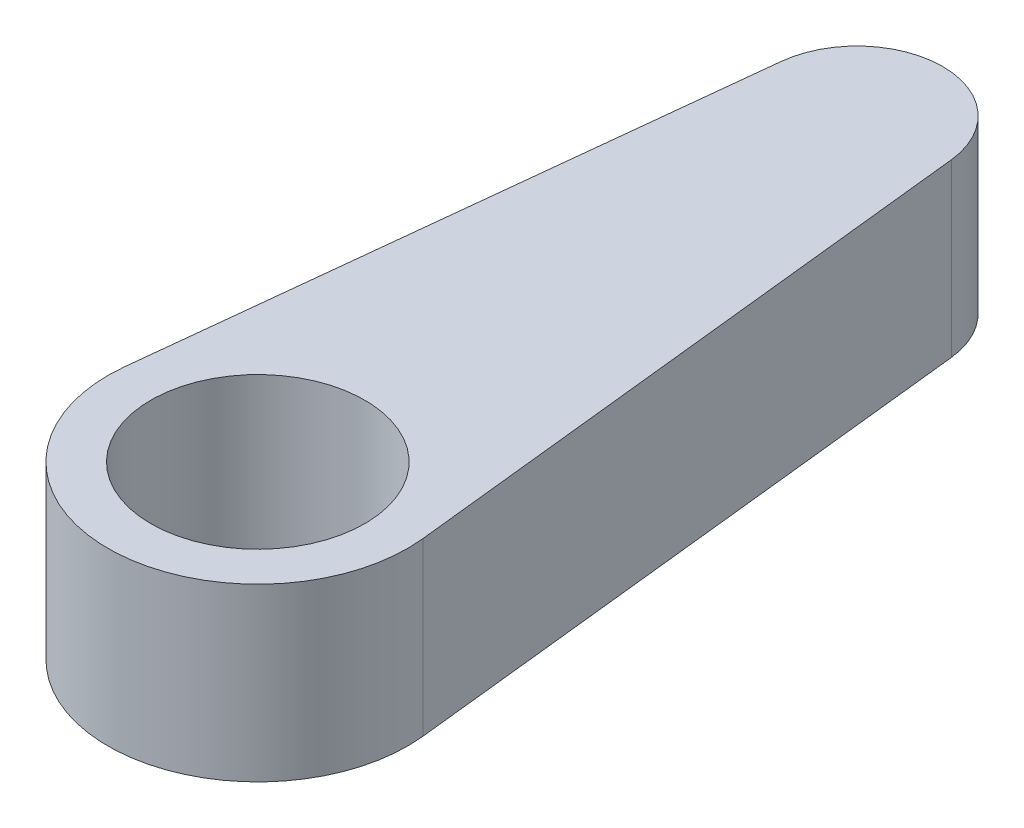
ISO-10303-21;
HEADER;
FILE_DESCRIPTION(('STEP AP214'),'2;1');
FILE_NAME('part.step','',(''),(''),'','','');
FILE_SCHEMA(('AUTOMOTIVE_DESIGN { 1 0 10303 214 1 1 1 1 }'));
ENDSEC;
DATA;
#1=APPLICATION_CONTEXT('core data for automotive mechanical design processes');
#2=APPLICATION_PROTOCOL_DEFINITION('international standard','automotive_design',2000,#1);
#3=PRODUCT_CONTEXT('',#1,'mechanical');
#4=PRODUCT('Part','Part','',(#3));
#5=PRODUCT_RELATED_PRODUCT_CATEGORY('part','',(#4));
#6=PRODUCT_DEFINITION_FORMATION('','',#4);
#7=PRODUCT_DEFINITION_CONTEXT('part definition',#1,'design');
#8=PRODUCT_DEFINITION('design','',#6,#7);
#9=PRODUCT_DEFINITION_SHAPE('','',#8);
#10=(LENGTH_UNIT() NAMED_UNIT(*) SI_UNIT(.MILLI.,.METRE.));
#11=(NAMED_UNIT(*) PLANE_ANGLE_UNIT() SI_UNIT($,.RADIAN.));
#12=(NAMED_UNIT(*) SI_UNIT($,.STERADIAN.) SOLID_ANGLE_UNIT());
#13=UNCERTAINTY_MEASURE_WITH_UNIT(LENGTH_MEASURE(1.E-05),#10,'distance_accuracy_value','');
#14=(GEOMETRIC_REPRESENTATION_CONTEXT(3) GLOBAL_UNCERTAINTY_ASSIGNED_CONTEXT((#13)) GLOBAL_UNIT_ASSIGNED_CONTEXT((#10,
#11,#12)) REPRESENTATION_CONTEXT('',''));
#15=CARTESIAN_POINT('',(0.,0.,0.));
#16=DIRECTION('',(0.,0.,1.));
#17=DIRECTION('',(1.,0.,0.));
#18=AXIS2_PLACEMENT_3D('',#15,#16,#17);
#19=CARTESIAN_POINT('',(-3.47985272676876,4.,-0.375));
#20=DIRECTION('',(0.994243636219647,0.,0.107142857142857));
#21=DIRECTION('',(0.107142857142857,0.,-0.994243636219647));
#22=AXIS2_PLACEMENT_3D('',#19,#20,#21);
#23=PLANE('',#22);
#24=DIRECTION('',(-0.107142857142857,0.,0.994243636219647));
#25=VECTOR('',#24,1.);
#26=CARTESIAN_POINT('',(-3.47985272676876,0.,-0.375));
#27=LINE('',#26,#25);
#28=CARTESIAN_POINT('',(-1.98848727243929,0.,-14.2142857142857));
#29=VERTEX_POINT('',#28);
#30=CARTESIAN_POINT('',(-3.47985272676876,0.,-0.375));
#31=VERTEX_POINT('',#30);
#32=EDGE_CURVE('E105',#29,#31,#27,.T.);
#33=ORIENTED_EDGE('',*,*,#32,.T.);
#34=DIRECTION('',(0.,-1.,0.));
#35=VECTOR('',#34,1.);
#36=CARTESIAN_POINT('',(-3.47985272676876,4.,-0.375));
#37=LINE('',#36,#35);
#38=CARTESIAN_POINT('',(-3.47985272676876,4.,-0.375));
#39=VERTEX_POINT('',#38);
#40=EDGE_CURVE('E11',#39,#31,#37,.T.);
#41=ORIENTED_EDGE('',*,*,#40,.F.);
#42=DIRECTION('',(-0.107142857142857,0.,0.994243636219647));
#43=VECTOR('',#42,1.);
#44=CARTESIAN_POINT('',(-3.47985272676876,4.,-0.375));
#45=LINE('',#44,#43);
#46=CARTESIAN_POINT('',(-1.98848727243929,4.,-14.2142857142857));
#47=VERTEX_POINT('',#46);
#48=EDGE_CURVE('E86',#47,#39,#45,.T.);
#49=ORIENTED_EDGE('',*,*,#48,.F.);
#50=DIRECTION('',(0.,-1.,0.));
#51=VECTOR('',#50,1.);
#52=CARTESIAN_POINT('',(-1.98848727243929,4.,-14.2142857142857));
#53=LINE('',#52,#51);
#54=EDGE_CURVE('E101',#47,#29,#53,.T.);
#55=ORIENTED_EDGE('',*,*,#54,.T.);
#56=EDGE_LOOP('',(#33,#41,#49,#55));
#57=FACE_BOUND('',#56,.T.);
#58=ADVANCED_FACE('F38',(#57),#23,.F.);
#59=CARTESIAN_POINT('',(0.,4.,0.));
#60=DIRECTION('',(0.,-1.,0.));
#61=DIRECTION('',(0.,0.,-1.));
#62=AXIS2_PLACEMENT_3D('',#59,#60,#61);
#63=CYLINDRICAL_SURFACE('',#62,3.5);
#64=CARTESIAN_POINT('',(0.,0.,0.));
#65=DIRECTION('',(0.,1.,0.));
#66=DIRECTION('',(0.,0.,1.));
#67=AXIS2_PLACEMENT_3D('',#64,#65,#66);
#68=CIRCLE('',#67,3.5);
#69=CARTESIAN_POINT('',(3.47985272676876,0.,-0.375));
#70=VERTEX_POINT('',#69);
#71=EDGE_CURVE('E92',#31,#70,#68,.T.);
#72=ORIENTED_EDGE('',*,*,#71,.T.);
#73=DIRECTION('',(0.,-1.,0.));
#74=VECTOR('',#73,1.);
#75=CARTESIAN_POINT('',(3.47985272676876,4.,-0.375));
#76=LINE('',#75,#74);
#77=CARTESIAN_POINT('',(3.47985272676876,4.,-0.375));
#78=VERTEX_POINT('',#77);
#79=EDGE_CURVE('E47',#78,#70,#76,.T.);
#80=ORIENTED_EDGE('',*,*,#79,.F.);
#81=CARTESIAN_POINT('',(0.,4.,0.));
#82=DIRECTION('',(0.,1.,0.));
#83=DIRECTION('',(0.,0.,1.));
#84=AXIS2_PLACEMENT_3D('',#81,#82,#83);
#85=CIRCLE('',#84,3.5);
#86=EDGE_CURVE('E81',#39,#78,#85,.T.);
#87=ORIENTED_EDGE('',*,*,#86,.F.);
#88=ORIENTED_EDGE('',*,*,#40,.T.);
#89=EDGE_LOOP('',(#72,#80,#87,#88));
#90=FACE_BOUND('',#89,.T.);
#91=ADVANCED_FACE('F91',(#90),#63,.T.);
#92=CARTESIAN_POINT('',(3.47985272676876,4.,-0.375));
#93=DIRECTION('',(0.994243636219647,0.,-0.107142857142857));
#94=DIRECTION('',(-0.107142857142857,0.,-0.994243636219647));
#95=AXIS2_PLACEMENT_3D('',#92,#93,#94);
#96=PLANE('',#95);
#97=DIRECTION('',(0.107142857142857,0.,0.994243636219647));
#98=VECTOR('',#97,1.);
#99=CARTESIAN_POINT('',(3.47985272676876,0.,-0.375));
#100=LINE('',#99,#98);
#101=CARTESIAN_POINT('',(1.98848727243929,0.,-14.2142857142857));
#102=VERTEX_POINT('',#101);
#103=EDGE_CURVE('E112',#102,#70,#100,.T.);
#104=ORIENTED_EDGE('',*,*,#103,.F.);
#105=DIRECTION('',(0.,-1.,0.));
#106=VECTOR('',#105,1.);
#107=CARTESIAN_POINT('',(1.98848727243929,4.,-14.2142857142857));
#108=LINE('',#107,#106);
#109=CARTESIAN_POINT('',(1.98848727243929,4.,-14.2142857142857));
#110=VERTEX_POINT('',#109);
#111=EDGE_CURVE('E71',#110,#102,#108,.T.);
#112=ORIENTED_EDGE('',*,*,#111,.F.);
#113=DIRECTION('',(0.107142857142857,0.,0.994243636219647));
#114=VECTOR('',#113,1.);
#115=CARTESIAN_POINT('',(3.47985272676876,4.,-0.375));
#116=LINE('',#115,#114);
#117=EDGE_CURVE('E84',#110,#78,#116,.T.);
#118=ORIENTED_EDGE('',*,*,#117,.T.);
#119=ORIENTED_EDGE('',*,*,#79,.T.);
#120=EDGE_LOOP('',(#104,#112,#118,#119));
#121=FACE_BOUND('',#120,.T.);
#122=ADVANCED_FACE('F97',(#121),#96,.T.);
#123=CARTESIAN_POINT('',(0.,4.,-14.));
#124=DIRECTION('',(0.,-1.,0.));
#125=DIRECTION('',(0.,0.,-1.));
#126=AXIS2_PLACEMENT_3D('',#123,#124,#125);
#127=CYLINDRICAL_SURFACE('',#126,2.);
#128=CARTESIAN_POINT('',(0.,0.,-14.));
#129=DIRECTION('',(0.,1.,0.));
#130=DIRECTION('',(0.,0.,1.));
#131=AXIS2_PLACEMENT_3D('',#128,#129,#130);
#132=CIRCLE('',#131,2.);
#133=EDGE_CURVE('E74',#102,#29,#132,.T.);
#134=ORIENTED_EDGE('',*,*,#133,.T.);
#135=ORIENTED_EDGE('',*,*,#54,.F.);
#136=CARTESIAN_POINT('',(0.,4.,-14.));
#137=DIRECTION('',(0.,1.,0.));
#138=DIRECTION('',(0.,0.,1.));
#139=AXIS2_PLACEMENT_3D('',#136,#137,#138);
#140=CIRCLE('',#139,2.);
#141=EDGE_CURVE('E55',#110,#47,#140,.T.);
#142=ORIENTED_EDGE('',*,*,#141,.F.);
#143=ORIENTED_EDGE('',*,*,#111,.T.);
#144=EDGE_LOOP('',(#134,#135,#142,#143));
#145=FACE_BOUND('',#144,.T.);
#146=ADVANCED_FACE('F134',(#145),#127,.T.);
#147=CARTESIAN_POINT('',(0.,4.,0.));
#148=DIRECTION('',(0.,1.,0.));
#149=DIRECTION('',(0.,0.,1.));
#150=AXIS2_PLACEMENT_3D('',#147,#148,#149);
#151=PLANE('',#150);
#152=CARTESIAN_POINT('',(0.,4.,0.));
#153=DIRECTION('',(0.,1.,0.));
#154=DIRECTION('',(0.,0.,1.));
#155=AXIS2_PLACEMENT_3D('',#152,#153,#154);
#156=CIRCLE('',#155,2.5);
#157=CARTESIAN_POINT('',(0.,4.,2.5));
#158=VERTEX_POINT('',#157);
#159=EDGE_CURVE('E205',#158,#158,#156,.T.);
#160=ORIENTED_EDGE('',*,*,#159,.F.);
#161=EDGE_LOOP('',(#160));
#162=FACE_BOUND('',#161,.T.);
#163=ORIENTED_EDGE('',*,*,#48,.T.);
#164=ORIENTED_EDGE('',*,*,#86,.T.);
#165=ORIENTED_EDGE('',*,*,#117,.F.);
#166=ORIENTED_EDGE('',*,*,#141,.T.);
#167=EDGE_LOOP('',(#163,#164,#165,#166));
#168=FACE_BOUND('',#167,.T.);
#169=ADVANCED_FACE('F82',(#162,#168),#151,.T.);
#170=CARTESIAN_POINT('',(0.,0.,0.));
#171=DIRECTION('',(0.,1.,0.));
#172=DIRECTION('',(0.,0.,1.));
#173=AXIS2_PLACEMENT_3D('',#170,#171,#172);
#174=PLANE('',#173);
#175=CARTESIAN_POINT('',(0.,0.,0.));
#176=DIRECTION('',(0.,1.,0.));
#177=DIRECTION('',(0.,0.,1.));
#178=AXIS2_PLACEMENT_3D('',#175,#176,#177);
#179=CIRCLE('',#178,2.5);
#180=CARTESIAN_POINT('',(0.,0.,2.5));
#181=VERTEX_POINT('',#180);
#182=EDGE_CURVE('E109',#181,#181,#179,.F.);
#183=ORIENTED_EDGE('',*,*,#182,.F.);
#184=EDGE_LOOP('',(#183));
#185=FACE_BOUND('',#184,.T.);
#186=ORIENTED_EDGE('',*,*,#32,.F.);
#187=ORIENTED_EDGE('',*,*,#133,.F.);
#188=ORIENTED_EDGE('',*,*,#103,.T.);
#189=ORIENTED_EDGE('',*,*,#71,.F.);
#190=EDGE_LOOP('',(#186,#187,#188,#189));
#191=FACE_BOUND('',#190,.T.);
#192=ADVANCED_FACE('F123',(#185,#191),#174,.F.);
#193=CARTESIAN_POINT('',(0.,-0.00100000000000013,0.));
#194=DIRECTION('',(0.,1.,0.));
#195=DIRECTION('',(0.,0.,1.));
#196=AXIS2_PLACEMENT_3D('',#193,#194,#195);
#197=CYLINDRICAL_SURFACE('',#196,2.5);
#198=ORIENTED_EDGE('',*,*,#159,.T.);
#199=EDGE_LOOP('',(#198));
#200=FACE_BOUND('',#199,.T.);
#201=ORIENTED_EDGE('',*,*,#182,.T.);
#202=EDGE_LOOP('',(#201));
#203=FACE_BOUND('',#202,.T.);
#204=ADVANCED_FACE('F125',(#200,#203),#197,.F.);
#205=CLOSED_SHELL('',(#58,#91,#122,#146,#169,#192,#204));
#206=MANIFOLD_SOLID_BREP('B2',#205);
#207=ADVANCED_BREP_SHAPE_REPRESENTATION('',(#18,#206),#14);
#208=SHAPE_DEFINITION_REPRESENTATION(#9,#207);
ENDSEC;
END-ISO-10303-21;
